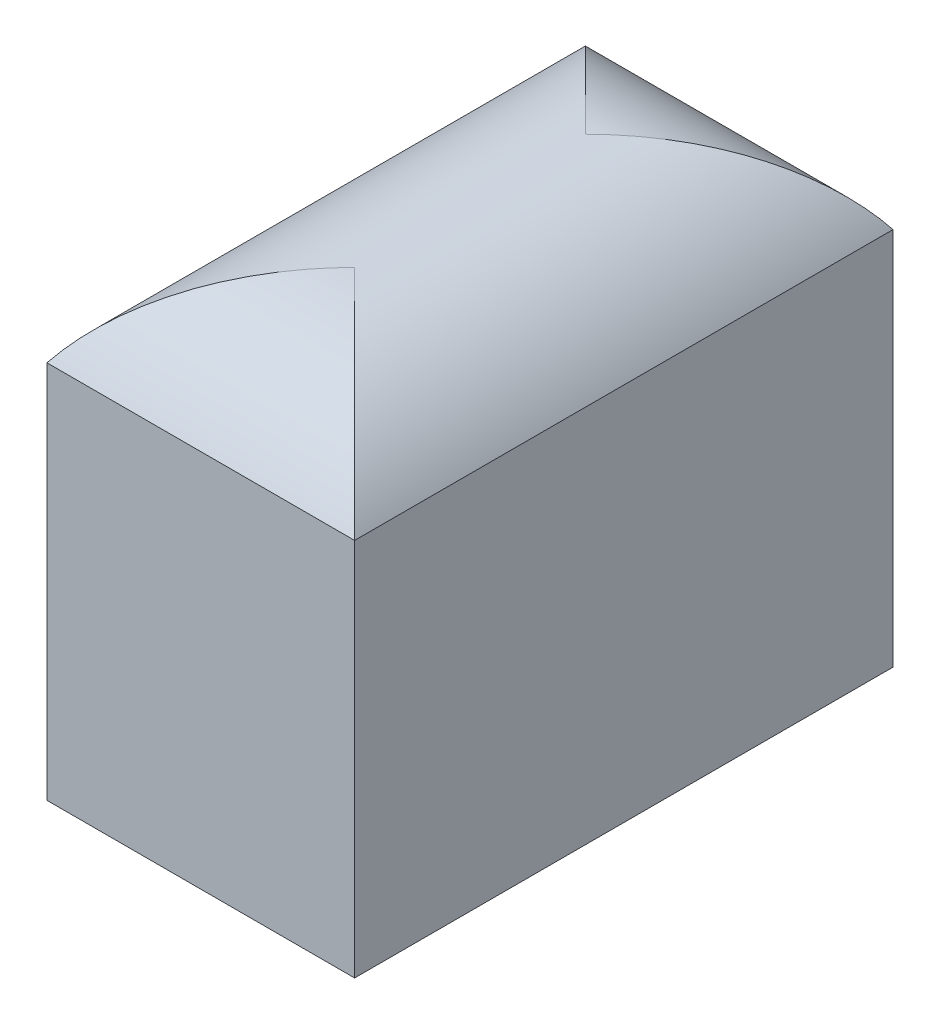
ISO-10303-21;
HEADER;
FILE_DESCRIPTION(('STEP AP214'),'2;1');
FILE_NAME('part.step','',(''),(''),'','','');
FILE_SCHEMA(('AUTOMOTIVE_DESIGN { 1 0 10303 214 1 1 1 1 }'));
ENDSEC;
DATA;
#1=APPLICATION_CONTEXT('core data for automotive mechanical design processes');
#2=APPLICATION_PROTOCOL_DEFINITION('international standard','automotive_design',2000,#1);
#3=PRODUCT_CONTEXT('',#1,'mechanical');
#4=PRODUCT('Part','Part','',(#3));
#5=PRODUCT_RELATED_PRODUCT_CATEGORY('part','',(#4));
#6=PRODUCT_DEFINITION_FORMATION('','',#4);
#7=PRODUCT_DEFINITION_CONTEXT('part definition',#1,'design');
#8=PRODUCT_DEFINITION('design','',#6,#7);
#9=PRODUCT_DEFINITION_SHAPE('','',#8);
#10=(LENGTH_UNIT() NAMED_UNIT(*) SI_UNIT(.MILLI.,.METRE.));
#11=(NAMED_UNIT(*) PLANE_ANGLE_UNIT() SI_UNIT($,.RADIAN.));
#12=(NAMED_UNIT(*) SI_UNIT($,.STERADIAN.) SOLID_ANGLE_UNIT());
#13=UNCERTAINTY_MEASURE_WITH_UNIT(LENGTH_MEASURE(1.E-05),#10,'distance_accuracy_value','');
#14=(GEOMETRIC_REPRESENTATION_CONTEXT(3) GLOBAL_UNCERTAINTY_ASSIGNED_CONTEXT((#13)) GLOBAL_UNIT_ASSIGNED_CONTEXT((#10,
#11,#12)) REPRESENTATION_CONTEXT('',''));
#15=CARTESIAN_POINT('',(0.,0.,0.));
#16=DIRECTION('',(0.,0.,1.));
#17=DIRECTION('',(1.,0.,0.));
#18=AXIS2_PLACEMENT_3D('',#15,#16,#17);
#19=CARTESIAN_POINT('',(0.,-1.2,1.75));
#20=DIRECTION('',(0.,0.,-1.));
#21=DIRECTION('',(-1.,0.,0.));
#22=AXIS2_PLACEMENT_3D('',#19,#20,#21);
#23=CYLINDRICAL_SURFACE('',#22,1.2);
#24=CARTESIAN_POINT('',(0.,-1.2,-0.75));
#25=DIRECTION('',(0.707106781186548,0.,-0.707106781186548));
#26=DIRECTION('',(-0.707106781186548,0.,-0.707106781186548));
#27=AXIS2_PLACEMENT_3D('',#24,#25,#26);
#28=ELLIPSE('',#27,1.69705627484771,1.2);
#29=CARTESIAN_POINT('',(-1.,-0.536675041928921,-1.75));
#30=VERTEX_POINT('',#29);
#31=CARTESIAN_POINT('',(0.,0.,-0.75));
#32=VERTEX_POINT('',#31);
#33=EDGE_CURVE('E65',#30,#32,#28,.T.);
#34=ORIENTED_EDGE('',*,*,#33,.F.);
#35=DIRECTION('',(0.,0.,-1.));
#36=VECTOR('',#35,1.);
#37=CARTESIAN_POINT('',(-1.,-0.536675041928921,1.75));
#38=LINE('',#37,#36);
#39=CARTESIAN_POINT('',(-1.,-0.536675041928921,1.75));
#40=VERTEX_POINT('',#39);
#41=EDGE_CURVE('E10',#40,#30,#38,.T.);
#42=ORIENTED_EDGE('',*,*,#41,.F.);
#43=CARTESIAN_POINT('',(0.,-1.2,0.75));
#44=DIRECTION('',(-0.707106781186548,0.,-0.707106781186548));
#45=DIRECTION('',(0.707106781186548,0.,-0.707106781186548));
#46=AXIS2_PLACEMENT_3D('',#43,#44,#45);
#47=ELLIPSE('',#46,1.69705627484771,1.2);
#48=CARTESIAN_POINT('',(0.,0.,0.75));
#49=VERTEX_POINT('',#48);
#50=EDGE_CURVE('E109',#40,#49,#47,.T.);
#51=ORIENTED_EDGE('',*,*,#50,.T.);
#52=CARTESIAN_POINT('',(0.,-1.2,0.75));
#53=DIRECTION('',(0.707106781186548,0.,-0.707106781186548));
#54=DIRECTION('',(-0.707106781186548,0.,-0.707106781186548));
#55=AXIS2_PLACEMENT_3D('',#52,#53,#54);
#56=ELLIPSE('',#55,1.69705627484771,1.2);
#57=CARTESIAN_POINT('',(1.,-0.536675041928921,1.75));
#58=VERTEX_POINT('',#57);
#59=EDGE_CURVE('E85',#49,#58,#56,.T.);
#60=ORIENTED_EDGE('',*,*,#59,.T.);
#61=DIRECTION('',(0.,0.,-1.));
#62=VECTOR('',#61,1.);
#63=CARTESIAN_POINT('',(1.,-0.536675041928921,1.75));
#64=LINE('',#63,#62);
#65=CARTESIAN_POINT('',(1.,-0.536675041928921,-1.75));
#66=VERTEX_POINT('',#65);
#67=EDGE_CURVE('E96',#58,#66,#64,.T.);
#68=ORIENTED_EDGE('',*,*,#67,.T.);
#69=CARTESIAN_POINT('',(0.,-1.2,-0.75));
#70=DIRECTION('',(-0.707106781186548,0.,-0.707106781186548));
#71=DIRECTION('',(0.707106781186548,0.,-0.707106781186548));
#72=AXIS2_PLACEMENT_3D('',#69,#70,#71);
#73=ELLIPSE('',#72,1.69705627484771,1.2);
#74=EDGE_CURVE('E67',#32,#66,#73,.T.);
#75=ORIENTED_EDGE('',*,*,#74,.F.);
#76=EDGE_LOOP('',(#34,#42,#51,#60,#68,#75));
#77=FACE_BOUND('',#76,.T.);
#78=ADVANCED_FACE('F16',(#77),#23,.T.);
#79=CARTESIAN_POINT('',(0.,-1.2,-1.75));
#80=DIRECTION('',(0.,0.,-1.));
#81=DIRECTION('',(-1.,0.,0.));
#82=AXIS2_PLACEMENT_3D('',#79,#80,#81);
#83=PLANE('',#82);
#84=DIRECTION('',(0.,-1.,0.));
#85=VECTOR('',#84,1.);
#86=CARTESIAN_POINT('',(-1.,-0.536675041928921,-1.75));
#87=LINE('',#86,#85);
#88=CARTESIAN_POINT('',(-1.,-3.,-1.75));
#89=VERTEX_POINT('',#88);
#90=EDGE_CURVE('E80',#30,#89,#87,.T.);
#91=ORIENTED_EDGE('',*,*,#90,.F.);
#92=DIRECTION('',(1.,0.,0.));
#93=VECTOR('',#92,1.);
#94=CARTESIAN_POINT('',(-1.,-0.536675041928921,-1.75));
#95=LINE('',#94,#93);
#96=EDGE_CURVE('E62',#30,#66,#95,.T.);
#97=ORIENTED_EDGE('',*,*,#96,.T.);
#98=DIRECTION('',(0.,1.,0.));
#99=VECTOR('',#98,1.);
#100=CARTESIAN_POINT('',(1.,-3.,-1.75));
#101=LINE('',#100,#99);
#102=CARTESIAN_POINT('',(1.,-3.,-1.75));
#103=VERTEX_POINT('',#102);
#104=EDGE_CURVE('E88',#103,#66,#101,.T.);
#105=ORIENTED_EDGE('',*,*,#104,.F.);
#106=DIRECTION('',(1.,0.,0.));
#107=VECTOR('',#106,1.);
#108=CARTESIAN_POINT('',(-1.,-3.,-1.75));
#109=LINE('',#108,#107);
#110=EDGE_CURVE('E82',#89,#103,#109,.T.);
#111=ORIENTED_EDGE('',*,*,#110,.F.);
#112=EDGE_LOOP('',(#91,#97,#105,#111));
#113=FACE_BOUND('',#112,.T.);
#114=ADVANCED_FACE('F81',(#113),#83,.T.);
#115=CARTESIAN_POINT('',(-1.,-0.536675041928921,1.75));
#116=DIRECTION('',(1.,0.,0.));
#117=DIRECTION('',(0.,1.,0.));
#118=AXIS2_PLACEMENT_3D('',#115,#116,#117);
#119=PLANE('',#118);
#120=ORIENTED_EDGE('',*,*,#90,.T.);
#121=DIRECTION('',(0.,0.,-1.));
#122=VECTOR('',#121,1.);
#123=CARTESIAN_POINT('',(-1.,-3.,1.75));
#124=LINE('',#123,#122);
#125=CARTESIAN_POINT('',(-1.,-3.,1.75));
#126=VERTEX_POINT('',#125);
#127=EDGE_CURVE('E23',#126,#89,#124,.T.);
#128=ORIENTED_EDGE('',*,*,#127,.F.);
#129=DIRECTION('',(0.,-1.,0.));
#130=VECTOR('',#129,1.);
#131=CARTESIAN_POINT('',(-1.,-0.536675041928921,1.75));
#132=LINE('',#131,#130);
#133=EDGE_CURVE('E35',#40,#126,#132,.T.);
#134=ORIENTED_EDGE('',*,*,#133,.F.);
#135=ORIENTED_EDGE('',*,*,#41,.T.);
#136=EDGE_LOOP('',(#120,#128,#134,#135));
#137=FACE_BOUND('',#136,.T.);
#138=ADVANCED_FACE('F87',(#137),#119,.F.);
#139=CARTESIAN_POINT('',(-1.,-3.,1.75));
#140=DIRECTION('',(0.,1.,0.));
#141=DIRECTION('',(0.,0.,1.));
#142=AXIS2_PLACEMENT_3D('',#139,#140,#141);
#143=PLANE('',#142);
#144=ORIENTED_EDGE('',*,*,#110,.T.);
#145=DIRECTION('',(0.,0.,-1.));
#146=VECTOR('',#145,1.);
#147=CARTESIAN_POINT('',(1.,-3.,1.75));
#148=LINE('',#147,#146);
#149=CARTESIAN_POINT('',(1.,-3.,1.75));
#150=VERTEX_POINT('',#149);
#151=EDGE_CURVE('E98',#150,#103,#148,.T.);
#152=ORIENTED_EDGE('',*,*,#151,.F.);
#153=DIRECTION('',(1.,0.,0.));
#154=VECTOR('',#153,1.);
#155=CARTESIAN_POINT('',(-1.,-3.,1.75));
#156=LINE('',#155,#154);
#157=EDGE_CURVE('E30',#126,#150,#156,.T.);
#158=ORIENTED_EDGE('',*,*,#157,.F.);
#159=ORIENTED_EDGE('',*,*,#127,.T.);
#160=EDGE_LOOP('',(#144,#152,#158,#159));
#161=FACE_BOUND('',#160,.T.);
#162=ADVANCED_FACE('F101',(#161),#143,.F.);
#163=CARTESIAN_POINT('',(1.,-3.,1.75));
#164=DIRECTION('',(-1.,0.,0.));
#165=DIRECTION('',(0.,-1.,0.));
#166=AXIS2_PLACEMENT_3D('',#163,#164,#165);
#167=PLANE('',#166);
#168=ORIENTED_EDGE('',*,*,#104,.T.);
#169=ORIENTED_EDGE('',*,*,#67,.F.);
#170=DIRECTION('',(0.,1.,0.));
#171=VECTOR('',#170,1.);
#172=CARTESIAN_POINT('',(1.,-3.,1.75));
#173=LINE('',#172,#171);
#174=EDGE_CURVE('E90',#150,#58,#173,.T.);
#175=ORIENTED_EDGE('',*,*,#174,.F.);
#176=ORIENTED_EDGE('',*,*,#151,.T.);
#177=EDGE_LOOP('',(#168,#169,#175,#176));
#178=FACE_BOUND('',#177,.T.);
#179=ADVANCED_FACE('F105',(#178),#167,.F.);
#180=CARTESIAN_POINT('',(0.,-1.2,1.75));
#181=DIRECTION('',(0.,0.,-1.));
#182=DIRECTION('',(-1.,0.,0.));
#183=AXIS2_PLACEMENT_3D('',#180,#181,#182);
#184=PLANE('',#183);
#185=ORIENTED_EDGE('',*,*,#174,.T.);
#186=DIRECTION('',(1.,0.,0.));
#187=VECTOR('',#186,1.);
#188=CARTESIAN_POINT('',(-1.,-0.536675041928921,1.75));
#189=LINE('',#188,#187);
#190=EDGE_CURVE('E77',#40,#58,#189,.T.);
#191=ORIENTED_EDGE('',*,*,#190,.F.);
#192=ORIENTED_EDGE('',*,*,#133,.T.);
#193=ORIENTED_EDGE('',*,*,#157,.T.);
#194=EDGE_LOOP('',(#185,#191,#192,#193));
#195=FACE_BOUND('',#194,.T.);
#196=ADVANCED_FACE('F106',(#195),#184,.F.);
#197=CARTESIAN_POINT('',(-1.,-1.2,0.75));
#198=DIRECTION('',(1.,0.,0.));
#199=DIRECTION('',(0.,0.,-1.));
#200=AXIS2_PLACEMENT_3D('',#197,#198,#199);
#201=CYLINDRICAL_SURFACE('',#200,1.2);
#202=ORIENTED_EDGE('',*,*,#50,.F.);
#203=ORIENTED_EDGE('',*,*,#190,.T.);
#204=ORIENTED_EDGE('',*,*,#59,.F.);
#205=EDGE_LOOP('',(#202,#203,#204));
#206=FACE_BOUND('',#205,.T.);
#207=ADVANCED_FACE('F114',(#206),#201,.T.);
#208=CARTESIAN_POINT('',(-1.,-1.2,-0.75));
#209=DIRECTION('',(1.,0.,0.));
#210=DIRECTION('',(0.,0.,-1.));
#211=AXIS2_PLACEMENT_3D('',#208,#209,#210);
#212=CYLINDRICAL_SURFACE('',#211,1.2);
#213=ORIENTED_EDGE('',*,*,#33,.T.);
#214=ORIENTED_EDGE('',*,*,#74,.T.);
#215=ORIENTED_EDGE('',*,*,#96,.F.);
#216=EDGE_LOOP('',(#213,#214,#215));
#217=FACE_BOUND('',#216,.T.);
#218=ADVANCED_FACE('F64',(#217),#212,.T.);
#219=CLOSED_SHELL('',(#78,#114,#138,#162,#179,#196,#207,#218));
#220=MANIFOLD_SOLID_BREP('B1',#219);
#221=ADVANCED_BREP_SHAPE_REPRESENTATION('',(#18,#220),#14);
#222=SHAPE_DEFINITION_REPRESENTATION(#9,#221);
ENDSEC;
END-ISO-10303-21;
